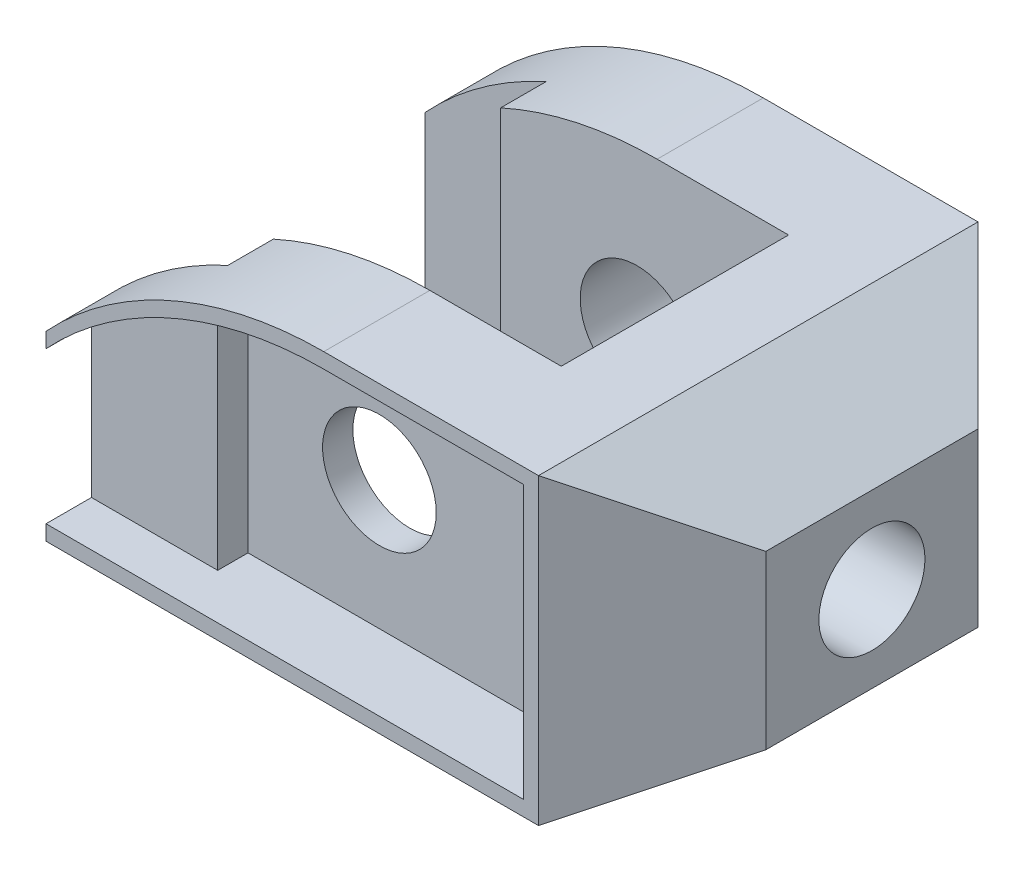
ISO-10303-21;
HEADER;
FILE_DESCRIPTION(('STEP AP214'),'2;1');
FILE_NAME('part.step','',(''),(''),'','','');
FILE_SCHEMA(('AUTOMOTIVE_DESIGN { 1 0 10303 214 1 1 1 1 }'));
ENDSEC;
DATA;
#1=APPLICATION_CONTEXT('core data for automotive mechanical design processes');
#2=APPLICATION_PROTOCOL_DEFINITION('international standard','automotive_design',2000,#1);
#3=PRODUCT_CONTEXT('',#1,'mechanical');
#4=PRODUCT('Part','Part','',(#3));
#5=PRODUCT_RELATED_PRODUCT_CATEGORY('part','',(#4));
#6=PRODUCT_DEFINITION_FORMATION('','',#4);
#7=PRODUCT_DEFINITION_CONTEXT('part definition',#1,'design');
#8=PRODUCT_DEFINITION('design','',#6,#7);
#9=PRODUCT_DEFINITION_SHAPE('','',#8);
#10=(LENGTH_UNIT() NAMED_UNIT(*) SI_UNIT(.MILLI.,.METRE.));
#11=(NAMED_UNIT(*) PLANE_ANGLE_UNIT() SI_UNIT($,.RADIAN.));
#12=(NAMED_UNIT(*) SI_UNIT($,.STERADIAN.) SOLID_ANGLE_UNIT());
#13=UNCERTAINTY_MEASURE_WITH_UNIT(LENGTH_MEASURE(1.E-05),#10,'distance_accuracy_value','');
#14=(GEOMETRIC_REPRESENTATION_CONTEXT(3) GLOBAL_UNCERTAINTY_ASSIGNED_CONTEXT((#13)) GLOBAL_UNIT_ASSIGNED_CONTEXT((#10,
#11,#12)) REPRESENTATION_CONTEXT('',''));
#15=CARTESIAN_POINT('',(0.,0.,0.));
#16=DIRECTION('',(0.,0.,1.));
#17=DIRECTION('',(1.,0.,0.));
#18=AXIS2_PLACEMENT_3D('',#15,#16,#17);
#19=CARTESIAN_POINT('',(-6.00000000000001,19.,-29.));
#20=DIRECTION('',(0.,0.,1.));
#21=DIRECTION('',(1.,0.,0.));
#22=AXIS2_PLACEMENT_3D('',#19,#20,#21);
#23=CYLINDRICAL_SURFACE('',#22,7.5);
#24=CARTESIAN_POINT('',(-6.00000000000001,19.,15.));
#25=DIRECTION('',(0.,0.,-1.));
#26=DIRECTION('',(-1.,0.,0.));
#27=AXIS2_PLACEMENT_3D('',#24,#25,#26);
#28=CIRCLE('',#27,7.5);
#29=CARTESIAN_POINT('',(-13.5,19.,15.));
#30=VERTEX_POINT('',#29);
#31=EDGE_CURVE('E378',#30,#30,#28,.F.);
#32=ORIENTED_EDGE('',*,*,#31,.F.);
#33=EDGE_LOOP('',(#32));
#34=FACE_BOUND('',#33,.T.);
#35=CARTESIAN_POINT('',(-6.00000000000001,19.,19.));
#36=DIRECTION('',(0.,0.,1.));
#37=DIRECTION('',(1.,0.,0.));
#38=AXIS2_PLACEMENT_3D('',#35,#36,#37);
#39=CIRCLE('',#38,7.5);
#40=CARTESIAN_POINT('',(1.49999999999999,19.,19.));
#41=VERTEX_POINT('',#40);
#42=EDGE_CURVE('E59',#41,#41,#39,.F.);
#43=ORIENTED_EDGE('',*,*,#42,.F.);
#44=EDGE_LOOP('',(#43));
#45=FACE_BOUND('',#44,.T.);
#46=ADVANCED_FACE('F55',(#34,#45),#23,.F.);
#47=CARTESIAN_POINT('',(-40.,40.,29.));
#48=DIRECTION('',(1.,0.,0.));
#49=DIRECTION('',(0.,0.,-1.));
#50=AXIS2_PLACEMENT_3D('',#47,#48,#49);
#51=PLANE('',#50);
#52=DIRECTION('',(0.,-1.,0.));
#53=VECTOR('',#52,1.);
#54=CARTESIAN_POINT('',(-40.,40.,-21.));
#55=LINE('',#54,#53);
#56=CARTESIAN_POINT('',(-40.,24.,-21.));
#57=VERTEX_POINT('',#56);
#58=CARTESIAN_POINT('',(-40.,0.,-21.));
#59=VERTEX_POINT('',#58);
#60=EDGE_CURVE('E309',#57,#59,#55,.T.);
#61=ORIENTED_EDGE('',*,*,#60,.F.);
#62=DIRECTION('',(0.,0.,1.));
#63=VECTOR('',#62,1.);
#64=CARTESIAN_POINT('',(-40.,24.,-29.));
#65=LINE('',#64,#63);
#66=CARTESIAN_POINT('',(-40.,24.,-29.));
#67=VERTEX_POINT('',#66);
#68=EDGE_CURVE('E417',#67,#57,#65,.T.);
#69=ORIENTED_EDGE('',*,*,#68,.F.);
#70=DIRECTION('',(0.,-1.,0.));
#71=VECTOR('',#70,1.);
#72=CARTESIAN_POINT('',(-40.,40.,-29.));
#73=LINE('',#72,#71);
#74=CARTESIAN_POINT('',(-40.,0.,-29.));
#75=VERTEX_POINT('',#74);
#76=EDGE_CURVE('E436',#67,#75,#73,.T.);
#77=ORIENTED_EDGE('',*,*,#76,.T.);
#78=DIRECTION('',(0.,0.,1.));
#79=VECTOR('',#78,1.);
#80=CARTESIAN_POINT('',(-40.,0.,29.));
#81=LINE('',#80,#79);
#82=EDGE_CURVE('E437',#75,#59,#81,.T.);
#83=ORIENTED_EDGE('',*,*,#82,.T.);
#84=EDGE_LOOP('',(#61,#69,#77,#83));
#85=FACE_BOUND('',#84,.T.);
#86=ADVANCED_FACE('F57',(#85),#51,.F.);
#87=DIRECTION('',(0.,-1.,0.));
#88=VECTOR('',#87,1.);
#89=CARTESIAN_POINT('',(-40.,22.,23.));
#90=LINE('',#89,#88);
#91=CARTESIAN_POINT('',(-40.,22.,23.));
#92=VERTEX_POINT('',#91);
#93=CARTESIAN_POINT('',(-40.,2.,23.));
#94=VERTEX_POINT('',#93);
#95=EDGE_CURVE('E253',#92,#94,#90,.T.);
#96=ORIENTED_EDGE('',*,*,#95,.F.);
#97=DIRECTION('',(0.,0.,1.));
#98=VECTOR('',#97,1.);
#99=CARTESIAN_POINT('',(-40.,22.,23.));
#100=LINE('',#99,#98);
#101=CARTESIAN_POINT('',(-40.,22.,29.));
#102=VERTEX_POINT('',#101);
#103=EDGE_CURVE('E277',#92,#102,#100,.T.);
#104=ORIENTED_EDGE('',*,*,#103,.T.);
#105=DIRECTION('',(0.,-1.,0.));
#106=VECTOR('',#105,1.);
#107=CARTESIAN_POINT('',(-40.,40.,29.));
#108=LINE('',#107,#106);
#109=CARTESIAN_POINT('',(-40.,24.,29.));
#110=VERTEX_POINT('',#109);
#111=EDGE_CURVE('E451',#110,#102,#108,.T.);
#112=ORIENTED_EDGE('',*,*,#111,.F.);
#113=CARTESIAN_POINT('',(-40.,24.,21.));
#114=VERTEX_POINT('',#113);
#115=EDGE_CURVE('E422',#114,#110,#65,.T.);
#116=ORIENTED_EDGE('',*,*,#115,.F.);
#117=DIRECTION('',(0.,-1.,0.));
#118=VECTOR('',#117,1.);
#119=CARTESIAN_POINT('',(-40.,40.,21.));
#120=LINE('',#119,#118);
#121=CARTESIAN_POINT('',(-40.,0.,21.));
#122=VERTEX_POINT('',#121);
#123=EDGE_CURVE('E312',#114,#122,#120,.T.);
#124=ORIENTED_EDGE('',*,*,#123,.T.);
#125=CARTESIAN_POINT('',(-40.,0.,29.));
#126=VERTEX_POINT('',#125);
#127=EDGE_CURVE('E421',#122,#126,#81,.T.);
#128=ORIENTED_EDGE('',*,*,#127,.T.);
#129=CARTESIAN_POINT('',(-40.,2.,29.));
#130=VERTEX_POINT('',#129);
#131=EDGE_CURVE('E450',#130,#126,#108,.T.);
#132=ORIENTED_EDGE('',*,*,#131,.F.);
#133=DIRECTION('',(0.,0.,1.));
#134=VECTOR('',#133,1.);
#135=CARTESIAN_POINT('',(-40.,2.,23.));
#136=LINE('',#135,#134);
#137=EDGE_CURVE('E81',#94,#130,#136,.T.);
#138=ORIENTED_EDGE('',*,*,#137,.F.);
#139=EDGE_LOOP('',(#96,#104,#112,#116,#124,#128,#132,#138));
#140=FACE_BOUND('',#139,.T.);
#141=ADVANCED_FACE('F528',(#140),#51,.F.);
#142=CARTESIAN_POINT('',(40.,40.,29.));
#143=DIRECTION('',(0.,0.,-1.));
#144=DIRECTION('',(-1.,0.,0.));
#145=AXIS2_PLACEMENT_3D('',#142,#143,#144);
#146=PLANE('',#145);
#147=ORIENTED_EDGE('',*,*,#111,.T.);
#148=CARTESIAN_POINT('',(-3.33939444035329,-12.,29.));
#149=DIRECTION('',(0.,0.,1.));
#150=DIRECTION('',(1.,0.,0.));
#151=AXIS2_PLACEMENT_3D('',#148,#149,#150);
#152=CIRCLE('',#151,50.);
#153=CARTESIAN_POINT('',(-3.3393944403533,38.,29.));
#154=VERTEX_POINT('',#153);
#155=EDGE_CURVE('E258',#154,#102,#152,.T.);
#156=ORIENTED_EDGE('',*,*,#155,.F.);
#157=DIRECTION('',(-1.,0.,0.));
#158=VECTOR('',#157,1.);
#159=CARTESIAN_POINT('',(23.,38.,29.));
#160=LINE('',#159,#158);
#161=CARTESIAN_POINT('',(23.,38.,29.));
#162=VERTEX_POINT('',#161);
#163=EDGE_CURVE('E271',#162,#154,#160,.T.);
#164=ORIENTED_EDGE('',*,*,#163,.F.);
#165=DIRECTION('',(0.,1.,0.));
#166=VECTOR('',#165,1.);
#167=CARTESIAN_POINT('',(23.,2.,29.));
#168=LINE('',#167,#166);
#169=CARTESIAN_POINT('',(23.,2.,29.));
#170=VERTEX_POINT('',#169);
#171=EDGE_CURVE('E267',#170,#162,#168,.T.);
#172=ORIENTED_EDGE('',*,*,#171,.F.);
#173=DIRECTION('',(1.,0.,0.));
#174=VECTOR('',#173,1.);
#175=CARTESIAN_POINT('',(-40.,2.,29.));
#176=LINE('',#175,#174);
#177=EDGE_CURVE('E264',#130,#170,#176,.T.);
#178=ORIENTED_EDGE('',*,*,#177,.F.);
#179=ORIENTED_EDGE('',*,*,#131,.T.);
#180=DIRECTION('',(1.,0.,0.));
#181=VECTOR('',#180,1.);
#182=CARTESIAN_POINT('',(40.,0.,29.));
#183=LINE('',#182,#181);
#184=CARTESIAN_POINT('',(25.,0.,29.));
#185=VERTEX_POINT('',#184);
#186=EDGE_CURVE('E441',#126,#185,#183,.T.);
#187=ORIENTED_EDGE('',*,*,#186,.T.);
#188=DIRECTION('',(0.,-1.,0.));
#189=VECTOR('',#188,1.);
#190=CARTESIAN_POINT('',(25.,40.,29.));
#191=LINE('',#190,#189);
#192=CARTESIAN_POINT('',(25.,40.,29.));
#193=VERTEX_POINT('',#192);
#194=EDGE_CURVE('E301',#193,#185,#191,.T.);
#195=ORIENTED_EDGE('',*,*,#194,.F.);
#196=DIRECTION('',(1.,0.,0.));
#197=VECTOR('',#196,1.);
#198=CARTESIAN_POINT('',(40.,40.,29.));
#199=LINE('',#198,#197);
#200=CARTESIAN_POINT('',(-3.33939444035328,40.,29.));
#201=VERTEX_POINT('',#200);
#202=EDGE_CURVE('E427',#201,#193,#199,.T.);
#203=ORIENTED_EDGE('',*,*,#202,.F.);
#204=CARTESIAN_POINT('',(-3.33939444035329,-10.,29.));
#205=DIRECTION('',(0.,0.,1.));
#206=DIRECTION('',(1.,0.,0.));
#207=AXIS2_PLACEMENT_3D('',#204,#205,#206);
#208=CIRCLE('',#207,50.);
#209=EDGE_CURVE('E394',#201,#110,#208,.T.);
#210=ORIENTED_EDGE('',*,*,#209,.T.);
#211=EDGE_LOOP('',(#147,#156,#164,#172,#178,#179,#187,#195,#203,#210));
#212=FACE_BOUND('',#211,.T.);
#213=ADVANCED_FACE('F521',(#212),#146,.F.);
#214=CARTESIAN_POINT('',(40.,40.,29.));
#215=DIRECTION('',(-1.,0.,0.));
#216=DIRECTION('',(0.,0.,1.));
#217=AXIS2_PLACEMENT_3D('',#214,#215,#216);
#218=PLANE('',#217);
#219=CARTESIAN_POINT('',(40.,20.,0.));
#220=DIRECTION('',(1.,0.,0.));
#221=DIRECTION('',(0.,0.,-1.));
#222=AXIS2_PLACEMENT_3D('',#219,#220,#221);
#223=CIRCLE('',#222,7.);
#224=CARTESIAN_POINT('',(40.,20.,-7.));
#225=VERTEX_POINT('',#224);
#226=EDGE_CURVE('E281',#225,#225,#223,.T.);
#227=ORIENTED_EDGE('',*,*,#226,.F.);
#228=EDGE_LOOP('',(#227));
#229=FACE_BOUND('',#228,.T.);
#230=DIRECTION('',(0.,-1.,0.));
#231=VECTOR('',#230,1.);
#232=CARTESIAN_POINT('',(40.,40.,14.0000000000001));
#233=LINE('',#232,#231);
#234=CARTESIAN_POINT('',(40.,31.3397459621557,14.0000000000002));
#235=VERTEX_POINT('',#234);
#236=CARTESIAN_POINT('',(40.,8.66025403784426,14.0000000000001));
#237=VERTEX_POINT('',#236);
#238=EDGE_CURVE('E297',#235,#237,#233,.T.);
#239=ORIENTED_EDGE('',*,*,#238,.T.);
#240=DIRECTION('',(0.,0.,1.));
#241=VECTOR('',#240,1.);
#242=CARTESIAN_POINT('',(40.,8.66025403784426,-29.));
#243=LINE('',#242,#241);
#244=CARTESIAN_POINT('',(40.,8.66025403784425,-14.0000000000002));
#245=VERTEX_POINT('',#244);
#246=EDGE_CURVE('E403',#245,#237,#243,.T.);
#247=ORIENTED_EDGE('',*,*,#246,.F.);
#248=DIRECTION('',(0.,-1.,0.));
#249=VECTOR('',#248,1.);
#250=CARTESIAN_POINT('',(40.,40.,-14.0000000000002));
#251=LINE('',#250,#249);
#252=CARTESIAN_POINT('',(40.,31.3397459621557,-14.0000000000002));
#253=VERTEX_POINT('',#252);
#254=EDGE_CURVE('E370',#253,#245,#251,.T.);
#255=ORIENTED_EDGE('',*,*,#254,.F.);
#256=DIRECTION('',(0.,0.,1.));
#257=VECTOR('',#256,1.);
#258=CARTESIAN_POINT('',(40.,31.3397459621557,-29.));
#259=LINE('',#258,#257);
#260=EDGE_CURVE('E395',#253,#235,#259,.T.);
#261=ORIENTED_EDGE('',*,*,#260,.T.);
#262=EDGE_LOOP('',(#239,#247,#255,#261));
#263=FACE_BOUND('',#262,.T.);
#264=ADVANCED_FACE('F541',(#229,#263),#218,.F.);
#265=CARTESIAN_POINT('',(40.,40.,-29.));
#266=DIRECTION('',(0.,0.,1.));
#267=DIRECTION('',(1.,0.,0.));
#268=AXIS2_PLACEMENT_3D('',#265,#266,#267);
#269=PLANE('',#268);
#270=CARTESIAN_POINT('',(-6.00000000000001,19.,-29.));
#271=DIRECTION('',(0.,0.,1.));
#272=DIRECTION('',(1.,0.,0.));
#273=AXIS2_PLACEMENT_3D('',#270,#271,#272);
#274=CIRCLE('',#273,7.5);
#275=CARTESIAN_POINT('',(1.49999999999999,19.,-29.));
#276=VERTEX_POINT('',#275);
#277=EDGE_CURVE('E389',#276,#276,#274,.T.);
#278=ORIENTED_EDGE('',*,*,#277,.T.);
#279=EDGE_LOOP('',(#278));
#280=FACE_BOUND('',#279,.T.);
#281=DIRECTION('',(0.,-1.,0.));
#282=VECTOR('',#281,1.);
#283=CARTESIAN_POINT('',(25.,40.,-29.));
#284=LINE('',#283,#282);
#285=CARTESIAN_POINT('',(25.,40.,-29.));
#286=VERTEX_POINT('',#285);
#287=CARTESIAN_POINT('',(25.,0.,-29.));
#288=VERTEX_POINT('',#287);
#289=EDGE_CURVE('E305',#286,#288,#284,.T.);
#290=ORIENTED_EDGE('',*,*,#289,.T.);
#291=DIRECTION('',(-1.,0.,0.));
#292=VECTOR('',#291,1.);
#293=CARTESIAN_POINT('',(40.,0.,-29.));
#294=LINE('',#293,#292);
#295=EDGE_CURVE('E432',#288,#75,#294,.T.);
#296=ORIENTED_EDGE('',*,*,#295,.T.);
#297=ORIENTED_EDGE('',*,*,#76,.F.);
#298=CARTESIAN_POINT('',(-3.33939444035329,-10.,-29.));
#299=DIRECTION('',(0.,0.,1.));
#300=DIRECTION('',(1.,0.,0.));
#301=AXIS2_PLACEMENT_3D('',#298,#299,#300);
#302=CIRCLE('',#301,50.);
#303=CARTESIAN_POINT('',(-3.33939444035329,40.,-29.));
#304=VERTEX_POINT('',#303);
#305=EDGE_CURVE('E410',#304,#67,#302,.T.);
#306=ORIENTED_EDGE('',*,*,#305,.F.);
#307=DIRECTION('',(-1.,0.,0.));
#308=VECTOR('',#307,1.);
#309=CARTESIAN_POINT('',(40.,40.,-29.));
#310=LINE('',#309,#308);
#311=EDGE_CURVE('E431',#286,#304,#310,.T.);
#312=ORIENTED_EDGE('',*,*,#311,.F.);
#313=EDGE_LOOP('',(#290,#296,#297,#306,#312));
#314=FACE_BOUND('',#313,.T.);
#315=ADVANCED_FACE('F551',(#280,#314),#269,.F.);
#316=CARTESIAN_POINT('',(0.,40.,0.));
#317=DIRECTION('',(0.,1.,0.));
#318=DIRECTION('',(0.,0.,1.));
#319=AXIS2_PLACEMENT_3D('',#316,#317,#318);
#320=PLANE('',#319);
#321=DIRECTION('',(0.,0.,-1.));
#322=VECTOR('',#321,1.);
#323=CARTESIAN_POINT('',(14.,40.,-15.));
#324=LINE('',#323,#322);
#325=CARTESIAN_POINT('',(14.,40.,15.));
#326=VERTEX_POINT('',#325);
#327=CARTESIAN_POINT('',(14.,40.,-15.));
#328=VERTEX_POINT('',#327);
#329=EDGE_CURVE('E362',#326,#328,#324,.T.);
#330=ORIENTED_EDGE('',*,*,#329,.F.);
#331=DIRECTION('',(1.,0.,0.));
#332=VECTOR('',#331,1.);
#333=CARTESIAN_POINT('',(-24.,40.,15.));
#334=LINE('',#333,#332);
#335=CARTESIAN_POINT('',(-3.33939444035329,40.,15.));
#336=VERTEX_POINT('',#335);
#337=EDGE_CURVE('E337',#336,#326,#334,.T.);
#338=ORIENTED_EDGE('',*,*,#337,.F.);
#339=DIRECTION('',(0.,0.,1.));
#340=VECTOR('',#339,1.);
#341=CARTESIAN_POINT('',(-3.33939444035329,40.,-29.));
#342=LINE('',#341,#340);
#343=EDGE_CURVE('E413',#336,#201,#342,.T.);
#344=ORIENTED_EDGE('',*,*,#343,.T.);
#345=ORIENTED_EDGE('',*,*,#202,.T.);
#346=DIRECTION('',(0.,0.,1.));
#347=VECTOR('',#346,1.);
#348=CARTESIAN_POINT('',(25.,40.,-29.));
#349=LINE('',#348,#347);
#350=EDGE_CURVE('E390',#286,#193,#349,.T.);
#351=ORIENTED_EDGE('',*,*,#350,.F.);
#352=ORIENTED_EDGE('',*,*,#311,.T.);
#353=CARTESIAN_POINT('',(-3.33939444035329,40.,-15.));
#354=VERTEX_POINT('',#353);
#355=EDGE_CURVE('E423',#304,#354,#342,.T.);
#356=ORIENTED_EDGE('',*,*,#355,.T.);
#357=DIRECTION('',(-1.,0.,0.));
#358=VECTOR('',#357,1.);
#359=CARTESIAN_POINT('',(-24.,40.,-15.));
#360=LINE('',#359,#358);
#361=EDGE_CURVE('E331',#328,#354,#360,.T.);
#362=ORIENTED_EDGE('',*,*,#361,.F.);
#363=EDGE_LOOP('',(#330,#338,#344,#345,#351,#352,#356,#362));
#364=FACE_BOUND('',#363,.T.);
#365=ADVANCED_FACE('F508',(#364),#320,.T.);
#366=CARTESIAN_POINT('',(0.,0.,0.));
#367=DIRECTION('',(0.,1.,0.));
#368=DIRECTION('',(0.,0.,1.));
#369=AXIS2_PLACEMENT_3D('',#366,#367,#368);
#370=PLANE('',#369);
#371=DIRECTION('',(-1.,0.,0.));
#372=VECTOR('',#371,1.);
#373=CARTESIAN_POINT('',(-40.,0.,-21.));
#374=LINE('',#373,#372);
#375=CARTESIAN_POINT('',(-24.,0.,-21.));
#376=VERTEX_POINT('',#375);
#377=EDGE_CURVE('E353',#376,#59,#374,.T.);
#378=ORIENTED_EDGE('',*,*,#377,.T.);
#379=ORIENTED_EDGE('',*,*,#82,.F.);
#380=ORIENTED_EDGE('',*,*,#295,.F.);
#381=DIRECTION('',(0.,0.,1.));
#382=VECTOR('',#381,1.);
#383=CARTESIAN_POINT('',(25.,0.,-29.));
#384=LINE('',#383,#382);
#385=EDGE_CURVE('E399',#288,#185,#384,.T.);
#386=ORIENTED_EDGE('',*,*,#385,.T.);
#387=ORIENTED_EDGE('',*,*,#186,.F.);
#388=ORIENTED_EDGE('',*,*,#127,.F.);
#389=DIRECTION('',(1.,0.,0.));
#390=VECTOR('',#389,1.);
#391=CARTESIAN_POINT('',(-40.,0.,21.));
#392=LINE('',#391,#390);
#393=CARTESIAN_POINT('',(-24.,0.,21.));
#394=VERTEX_POINT('',#393);
#395=EDGE_CURVE('E349',#122,#394,#392,.T.);
#396=ORIENTED_EDGE('',*,*,#395,.T.);
#397=DIRECTION('',(0.,0.,-1.));
#398=VECTOR('',#397,1.);
#399=CARTESIAN_POINT('',(-24.,0.,21.));
#400=LINE('',#399,#398);
#401=CARTESIAN_POINT('',(-24.,0.,15.));
#402=VERTEX_POINT('',#401);
#403=EDGE_CURVE('E345',#394,#402,#400,.T.);
#404=ORIENTED_EDGE('',*,*,#403,.T.);
#405=DIRECTION('',(1.,0.,0.));
#406=VECTOR('',#405,1.);
#407=CARTESIAN_POINT('',(-24.,0.,15.));
#408=LINE('',#407,#406);
#409=CARTESIAN_POINT('',(14.,0.,15.));
#410=VERTEX_POINT('',#409);
#411=EDGE_CURVE('E341',#402,#410,#408,.T.);
#412=ORIENTED_EDGE('',*,*,#411,.T.);
#413=DIRECTION('',(0.,0.,-1.));
#414=VECTOR('',#413,1.);
#415=CARTESIAN_POINT('',(14.,0.,-15.));
#416=LINE('',#415,#414);
#417=CARTESIAN_POINT('',(14.,0.,-15.));
#418=VERTEX_POINT('',#417);
#419=EDGE_CURVE('E336',#410,#418,#416,.T.);
#420=ORIENTED_EDGE('',*,*,#419,.T.);
#421=DIRECTION('',(-1.,0.,0.));
#422=VECTOR('',#421,1.);
#423=CARTESIAN_POINT('',(-24.,0.,-15.));
#424=LINE('',#423,#422);
#425=CARTESIAN_POINT('',(-24.,0.,-15.));
#426=VERTEX_POINT('',#425);
#427=EDGE_CURVE('E332',#418,#426,#424,.T.);
#428=ORIENTED_EDGE('',*,*,#427,.T.);
#429=DIRECTION('',(0.,0.,-1.));
#430=VECTOR('',#429,1.);
#431=CARTESIAN_POINT('',(-24.,0.,-21.));
#432=LINE('',#431,#430);
#433=EDGE_CURVE('E302',#426,#376,#432,.T.);
#434=ORIENTED_EDGE('',*,*,#433,.T.);
#435=EDGE_LOOP('',(#378,#379,#380,#386,#387,#388,#396,#404,#412,#420,#428,#434));
#436=FACE_BOUND('',#435,.T.);
#437=ADVANCED_FACE('F499',(#436),#370,.F.);
#438=CARTESIAN_POINT('',(6.24999999999986,-10.8253175473054,-29.));
#439=DIRECTION('',(-0.499999999999995,0.866025403784442,0.));
#440=DIRECTION('',(-0.866025403784442,-0.499999999999994,0.));
#441=AXIS2_PLACEMENT_3D('',#438,#439,#440);
#442=PLANE('',#441);
#443=DIRECTION('',(0.654653670707981,0.377964473009224,-0.654653670707975));
#444=VECTOR('',#443,1.);
#445=CARTESIAN_POINT('',(39.1428571428571,8.16538237853884,14.8571428571431));
#446=LINE('',#445,#444);
#447=EDGE_CURVE('E386',#185,#237,#446,.T.);
#448=ORIENTED_EDGE('',*,*,#447,.F.);
#449=ORIENTED_EDGE('',*,*,#385,.F.);
#450=DIRECTION('',(-0.654653670707982,-0.377964473009224,-0.654653670707974));
#451=VECTOR('',#450,1.);
#452=CARTESIAN_POINT('',(14.2857142857141,-6.18589574131741,-39.7142857142857));
#453=LINE('',#452,#451);
#454=EDGE_CURVE('E383',#245,#288,#453,.T.);
#455=ORIENTED_EDGE('',*,*,#454,.F.);
#456=ORIENTED_EDGE('',*,*,#246,.T.);
#457=EDGE_LOOP('',(#448,#449,#455,#456));
#458=FACE_BOUND('',#457,.T.);
#459=ADVANCED_FACE('F536',(#458),#442,.F.);
#460=CARTESIAN_POINT('',(-3.33939444035329,-10.,-29.));
#461=DIRECTION('',(0.,0.,1.));
#462=DIRECTION('',(1.,0.,0.));
#463=AXIS2_PLACEMENT_3D('',#460,#461,#462);
#464=CYLINDRICAL_SURFACE('',#463,50.);
#465=DIRECTION('',(0.,0.,1.));
#466=VECTOR('',#465,1.);
#467=CARTESIAN_POINT('',(-24.,35.5317403347236,-29.));
#468=LINE('',#467,#466);
#469=CARTESIAN_POINT('',(-24.,35.5317403347236,15.));
#470=VERTEX_POINT('',#469);
#471=CARTESIAN_POINT('',(-24.,35.5317403347236,21.));
#472=VERTEX_POINT('',#471);
#473=EDGE_CURVE('E65',#470,#472,#468,.T.);
#474=ORIENTED_EDGE('',*,*,#473,.T.);
#475=CARTESIAN_POINT('',(-3.33939444035329,-10.,21.));
#476=DIRECTION('',(0.,0.,-1.));
#477=DIRECTION('',(-1.,0.,0.));
#478=AXIS2_PLACEMENT_3D('',#475,#476,#477);
#479=CIRCLE('',#478,50.);
#480=EDGE_CURVE('E12',#472,#114,#479,.F.);
#481=ORIENTED_EDGE('',*,*,#480,.T.);
#482=ORIENTED_EDGE('',*,*,#115,.T.);
#483=ORIENTED_EDGE('',*,*,#209,.F.);
#484=ORIENTED_EDGE('',*,*,#343,.F.);
#485=CARTESIAN_POINT('',(-3.33939444035329,-10.,15.));
#486=DIRECTION('',(0.,0.,-1.));
#487=DIRECTION('',(-1.,0.,0.));
#488=AXIS2_PLACEMENT_3D('',#485,#486,#487);
#489=CIRCLE('',#488,50.);
#490=EDGE_CURVE('E379',#336,#470,#489,.F.);
#491=ORIENTED_EDGE('',*,*,#490,.T.);
#492=EDGE_LOOP('',(#474,#481,#482,#483,#484,#491));
#493=FACE_BOUND('',#492,.T.);
#494=ADVANCED_FACE('F512',(#493),#464,.T.);
#495=ORIENTED_EDGE('',*,*,#68,.T.);
#496=CARTESIAN_POINT('',(-3.33939444035329,-10.,-21.));
#497=DIRECTION('',(0.,0.,1.));
#498=DIRECTION('',(1.,0.,0.));
#499=AXIS2_PLACEMENT_3D('',#496,#497,#498);
#500=CIRCLE('',#499,50.);
#501=CARTESIAN_POINT('',(-24.,35.5317403347236,-21.));
#502=VERTEX_POINT('',#501);
#503=EDGE_CURVE('E473',#57,#502,#500,.F.);
#504=ORIENTED_EDGE('',*,*,#503,.T.);
#505=DIRECTION('',(0.,0.,1.));
#506=VECTOR('',#505,1.);
#507=CARTESIAN_POINT('',(-24.,35.5317403347236,-29.));
#508=LINE('',#507,#506);
#509=CARTESIAN_POINT('',(-24.,35.5317403347236,-15.));
#510=VERTEX_POINT('',#509);
#511=EDGE_CURVE('E469',#502,#510,#508,.T.);
#512=ORIENTED_EDGE('',*,*,#511,.T.);
#513=CARTESIAN_POINT('',(-3.33939444035329,-10.,-15.));
#514=DIRECTION('',(0.,0.,1.));
#515=DIRECTION('',(1.,0.,0.));
#516=AXIS2_PLACEMENT_3D('',#513,#514,#515);
#517=CIRCLE('',#516,50.);
#518=EDGE_CURVE('E374',#510,#354,#517,.F.);
#519=ORIENTED_EDGE('',*,*,#518,.T.);
#520=ORIENTED_EDGE('',*,*,#355,.F.);
#521=ORIENTED_EDGE('',*,*,#305,.T.);
#522=EDGE_LOOP('',(#495,#504,#512,#519,#520,#521));
#523=FACE_BOUND('',#522,.T.);
#524=ADVANCED_FACE('F555',(#523),#464,.T.);
#525=CARTESIAN_POINT('',(23.5705080756885,40.8253175473056,-29.));
#526=DIRECTION('',(0.499999999999995,0.866025403784442,0.));
#527=DIRECTION('',(-0.866025403784442,0.499999999999995,0.));
#528=AXIS2_PLACEMENT_3D('',#525,#526,#527);
#529=PLANE('',#528);
#530=ORIENTED_EDGE('',*,*,#350,.T.);
#531=DIRECTION('',(0.654653670707981,-0.377964473009224,-0.654653670707975));
#532=VECTOR('',#531,1.);
#533=CARTESIAN_POINT('',(49.0402903289649,26.1203319071755,4.95970967103531));
#534=LINE('',#533,#532);
#535=EDGE_CURVE('E465',#193,#235,#534,.T.);
#536=ORIENTED_EDGE('',*,*,#535,.T.);
#537=ORIENTED_EDGE('',*,*,#260,.F.);
#538=DIRECTION('',(-0.654653670707981,0.377964473009225,-0.654653670707974));
#539=VECTOR('',#538,1.);
#540=CARTESIAN_POINT('',(24.183147471822,40.4716100270318,-29.816852528178));
#541=LINE('',#540,#539);
#542=EDGE_CURVE('E455',#253,#286,#541,.T.);
#543=ORIENTED_EDGE('',*,*,#542,.T.);
#544=EDGE_LOOP('',(#530,#536,#537,#543));
#545=FACE_BOUND('',#544,.T.);
#546=ADVANCED_FACE('F545',(#545),#529,.T.);
#547=ORIENTED_EDGE('',*,*,#277,.F.);
#548=EDGE_LOOP('',(#547));
#549=FACE_BOUND('',#548,.T.);
#550=CARTESIAN_POINT('',(-6.00000000000001,19.,-15.));
#551=DIRECTION('',(0.,0.,1.));
#552=DIRECTION('',(1.,0.,0.));
#553=AXIS2_PLACEMENT_3D('',#550,#551,#552);
#554=CIRCLE('',#553,7.5);
#555=CARTESIAN_POINT('',(1.49999999999999,19.,-15.));
#556=VERTEX_POINT('',#555);
#557=EDGE_CURVE('E373',#556,#556,#554,.F.);
#558=ORIENTED_EDGE('',*,*,#557,.F.);
#559=EDGE_LOOP('',(#558));
#560=FACE_BOUND('',#559,.T.);
#561=ADVANCED_FACE('F573',(#549,#560),#23,.F.);
#562=CARTESIAN_POINT('',(-24.,40.,15.));
#563=DIRECTION('',(0.,0.,-1.));
#564=DIRECTION('',(-1.,0.,0.));
#565=AXIS2_PLACEMENT_3D('',#562,#563,#564);
#566=PLANE('',#565);
#567=ORIENTED_EDGE('',*,*,#337,.T.);
#568=DIRECTION('',(0.,-1.,0.));
#569=VECTOR('',#568,1.);
#570=CARTESIAN_POINT('',(14.,40.,15.));
#571=LINE('',#570,#569);
#572=EDGE_CURVE('E322',#326,#410,#571,.T.);
#573=ORIENTED_EDGE('',*,*,#572,.T.);
#574=ORIENTED_EDGE('',*,*,#411,.F.);
#575=DIRECTION('',(0.,-1.,0.));
#576=VECTOR('',#575,1.);
#577=CARTESIAN_POINT('',(-24.,40.,15.));
#578=LINE('',#577,#576);
#579=EDGE_CURVE('E319',#470,#402,#578,.T.);
#580=ORIENTED_EDGE('',*,*,#579,.F.);
#581=ORIENTED_EDGE('',*,*,#490,.F.);
#582=EDGE_LOOP('',(#567,#573,#574,#580,#581));
#583=FACE_BOUND('',#582,.T.);
#584=ORIENTED_EDGE('',*,*,#31,.T.);
#585=EDGE_LOOP('',(#584));
#586=FACE_BOUND('',#585,.T.);
#587=ADVANCED_FACE('F503',(#583,#586),#566,.T.);
#588=CARTESIAN_POINT('',(-24.,40.,-15.));
#589=DIRECTION('',(0.,0.,1.));
#590=DIRECTION('',(1.,0.,0.));
#591=AXIS2_PLACEMENT_3D('',#588,#589,#590);
#592=PLANE('',#591);
#593=DIRECTION('',(0.,-1.,0.));
#594=VECTOR('',#593,1.);
#595=CARTESIAN_POINT('',(-24.,40.,-15.));
#596=LINE('',#595,#594);
#597=EDGE_CURVE('E328',#510,#426,#596,.T.);
#598=ORIENTED_EDGE('',*,*,#597,.T.);
#599=ORIENTED_EDGE('',*,*,#427,.F.);
#600=DIRECTION('',(0.,-1.,0.));
#601=VECTOR('',#600,1.);
#602=CARTESIAN_POINT('',(14.,40.,-15.));
#603=LINE('',#602,#601);
#604=EDGE_CURVE('E325',#328,#418,#603,.T.);
#605=ORIENTED_EDGE('',*,*,#604,.F.);
#606=ORIENTED_EDGE('',*,*,#361,.T.);
#607=ORIENTED_EDGE('',*,*,#518,.F.);
#608=EDGE_LOOP('',(#598,#599,#605,#606,#607));
#609=FACE_BOUND('',#608,.T.);
#610=ORIENTED_EDGE('',*,*,#557,.T.);
#611=EDGE_LOOP('',(#610));
#612=FACE_BOUND('',#611,.T.);
#613=ADVANCED_FACE('F567',(#609,#612),#592,.T.);
#614=CARTESIAN_POINT('',(-24.,40.,-21.));
#615=DIRECTION('',(-1.,0.,0.));
#616=DIRECTION('',(0.,0.,1.));
#617=AXIS2_PLACEMENT_3D('',#614,#615,#616);
#618=PLANE('',#617);
#619=DIRECTION('',(0.,-1.,0.));
#620=VECTOR('',#619,1.);
#621=CARTESIAN_POINT('',(-24.,40.,-21.));
#622=LINE('',#621,#620);
#623=EDGE_CURVE('E306',#502,#376,#622,.T.);
#624=ORIENTED_EDGE('',*,*,#623,.T.);
#625=ORIENTED_EDGE('',*,*,#433,.F.);
#626=ORIENTED_EDGE('',*,*,#597,.F.);
#627=ORIENTED_EDGE('',*,*,#511,.F.);
#628=EDGE_LOOP('',(#624,#625,#626,#627));
#629=FACE_BOUND('',#628,.T.);
#630=ADVANCED_FACE('F565',(#629),#618,.T.);
#631=CARTESIAN_POINT('',(-40.,40.,-21.));
#632=DIRECTION('',(0.,0.,1.));
#633=DIRECTION('',(1.,0.,0.));
#634=AXIS2_PLACEMENT_3D('',#631,#632,#633);
#635=PLANE('',#634);
#636=ORIENTED_EDGE('',*,*,#60,.T.);
#637=ORIENTED_EDGE('',*,*,#377,.F.);
#638=ORIENTED_EDGE('',*,*,#623,.F.);
#639=ORIENTED_EDGE('',*,*,#503,.F.);
#640=EDGE_LOOP('',(#636,#637,#638,#639));
#641=FACE_BOUND('',#640,.T.);
#642=ADVANCED_FACE('F560',(#641),#635,.T.);
#643=CARTESIAN_POINT('',(-40.,40.,21.));
#644=DIRECTION('',(0.,0.,-1.));
#645=DIRECTION('',(-1.,0.,0.));
#646=AXIS2_PLACEMENT_3D('',#643,#644,#645);
#647=PLANE('',#646);
#648=DIRECTION('',(0.,-1.,0.));
#649=VECTOR('',#648,1.);
#650=CARTESIAN_POINT('',(-24.,40.,21.));
#651=LINE('',#650,#649);
#652=EDGE_CURVE('E316',#472,#394,#651,.T.);
#653=ORIENTED_EDGE('',*,*,#652,.T.);
#654=ORIENTED_EDGE('',*,*,#395,.F.);
#655=ORIENTED_EDGE('',*,*,#123,.F.);
#656=ORIENTED_EDGE('',*,*,#480,.F.);
#657=EDGE_LOOP('',(#653,#654,#655,#656));
#658=FACE_BOUND('',#657,.T.);
#659=ADVANCED_FACE('F631',(#658),#647,.T.);
#660=CARTESIAN_POINT('',(-24.,40.,21.));
#661=DIRECTION('',(-1.,0.,0.));
#662=DIRECTION('',(0.,0.,1.));
#663=AXIS2_PLACEMENT_3D('',#660,#661,#662);
#664=PLANE('',#663);
#665=ORIENTED_EDGE('',*,*,#579,.T.);
#666=ORIENTED_EDGE('',*,*,#403,.F.);
#667=ORIENTED_EDGE('',*,*,#652,.F.);
#668=ORIENTED_EDGE('',*,*,#473,.F.);
#669=EDGE_LOOP('',(#665,#666,#667,#668));
#670=FACE_BOUND('',#669,.T.);
#671=ADVANCED_FACE('F490',(#670),#664,.T.);
#672=CARTESIAN_POINT('',(14.,40.,-15.));
#673=DIRECTION('',(-1.,0.,0.));
#674=DIRECTION('',(0.,0.,1.));
#675=AXIS2_PLACEMENT_3D('',#672,#673,#674);
#676=PLANE('',#675);
#677=CARTESIAN_POINT('',(14.,20.,0.));
#678=DIRECTION('',(-1.,0.,0.));
#679=DIRECTION('',(0.,0.,1.));
#680=AXIS2_PLACEMENT_3D('',#677,#678,#679);
#681=CIRCLE('',#680,7.);
#682=CARTESIAN_POINT('',(14.,20.,6.99999999999999));
#683=VERTEX_POINT('',#682);
#684=EDGE_CURVE('E296',#683,#683,#681,.T.);
#685=ORIENTED_EDGE('',*,*,#684,.F.);
#686=EDGE_LOOP('',(#685));
#687=FACE_BOUND('',#686,.T.);
#688=ORIENTED_EDGE('',*,*,#419,.F.);
#689=ORIENTED_EDGE('',*,*,#572,.F.);
#690=ORIENTED_EDGE('',*,*,#329,.T.);
#691=ORIENTED_EDGE('',*,*,#604,.T.);
#692=EDGE_LOOP('',(#688,#689,#690,#691));
#693=FACE_BOUND('',#692,.T.);
#694=ADVANCED_FACE('F486',(#687,#693),#676,.T.);
#695=CARTESIAN_POINT('',(40.,40.,-14.0000000000002));
#696=DIRECTION('',(0.707106781186544,0.,-0.707106781186551));
#697=DIRECTION('',(-0.707106781186551,0.,-0.707106781186544));
#698=AXIS2_PLACEMENT_3D('',#695,#696,#697);
#699=PLANE('',#698);
#700=ORIENTED_EDGE('',*,*,#454,.T.);
#701=ORIENTED_EDGE('',*,*,#289,.F.);
#702=ORIENTED_EDGE('',*,*,#542,.F.);
#703=ORIENTED_EDGE('',*,*,#254,.T.);
#704=EDGE_LOOP('',(#700,#701,#702,#703));
#705=FACE_BOUND('',#704,.T.);
#706=ADVANCED_FACE('F489',(#705),#699,.T.);
#707=CARTESIAN_POINT('',(40.,40.,14.0000000000001));
#708=DIRECTION('',(0.707106781186544,0.,0.707106781186551));
#709=DIRECTION('',(0.707106781186551,0.,-0.707106781186544));
#710=AXIS2_PLACEMENT_3D('',#707,#708,#709);
#711=PLANE('',#710);
#712=ORIENTED_EDGE('',*,*,#447,.T.);
#713=ORIENTED_EDGE('',*,*,#238,.F.);
#714=ORIENTED_EDGE('',*,*,#535,.F.);
#715=ORIENTED_EDGE('',*,*,#194,.T.);
#716=EDGE_LOOP('',(#712,#713,#714,#715));
#717=FACE_BOUND('',#716,.T.);
#718=ADVANCED_FACE('F539',(#717),#711,.T.);
#719=CARTESIAN_POINT('',(-40.,20.,0.));
#720=DIRECTION('',(1.,0.,0.));
#721=DIRECTION('',(0.,0.,-1.));
#722=AXIS2_PLACEMENT_3D('',#719,#720,#721);
#723=CYLINDRICAL_SURFACE('',#722,7.);
#724=ORIENTED_EDGE('',*,*,#684,.T.);
#725=EDGE_LOOP('',(#724));
#726=FACE_BOUND('',#725,.T.);
#727=ORIENTED_EDGE('',*,*,#226,.T.);
#728=EDGE_LOOP('',(#727));
#729=FACE_BOUND('',#728,.T.);
#730=ADVANCED_FACE('F483',(#726,#729),#723,.F.);
#731=CARTESIAN_POINT('',(-3.33939444035329,-12.,23.));
#732=DIRECTION('',(0.,0.,1.));
#733=DIRECTION('',(1.,0.,0.));
#734=AXIS2_PLACEMENT_3D('',#731,#732,#733);
#735=PLANE('',#734);
#736=DIRECTION('',(0.,-1.,0.));
#737=VECTOR('',#736,1.);
#738=CARTESIAN_POINT('',(-23.3393944403533,33.8257569495584,23.));
#739=LINE('',#738,#737);
#740=CARTESIAN_POINT('',(-23.3393944403533,33.8257569495584,23.));
#741=VERTEX_POINT('',#740);
#742=CARTESIAN_POINT('',(-23.3393944403533,2.,23.));
#743=VERTEX_POINT('',#742);
#744=EDGE_CURVE('E73',#741,#743,#739,.T.);
#745=ORIENTED_EDGE('',*,*,#744,.F.);
#746=CARTESIAN_POINT('',(-3.33939444035329,-12.,23.));
#747=DIRECTION('',(0.,0.,1.));
#748=DIRECTION('',(1.,0.,0.));
#749=AXIS2_PLACEMENT_3D('',#746,#747,#748);
#750=CIRCLE('',#749,50.);
#751=EDGE_CURVE('E221',#741,#92,#750,.T.);
#752=ORIENTED_EDGE('',*,*,#751,.T.);
#753=ORIENTED_EDGE('',*,*,#95,.T.);
#754=DIRECTION('',(1.,0.,0.));
#755=VECTOR('',#754,1.);
#756=CARTESIAN_POINT('',(-40.,2.,23.));
#757=LINE('',#756,#755);
#758=EDGE_CURVE('E257',#94,#743,#757,.T.);
#759=ORIENTED_EDGE('',*,*,#758,.T.);
#760=EDGE_LOOP('',(#745,#752,#753,#759));
#761=FACE_BOUND('',#760,.T.);
#762=ADVANCED_FACE('F610',(#761),#735,.T.);
#763=CARTESIAN_POINT('',(-3.33939444035329,-12.,23.));
#764=DIRECTION('',(0.,0.,1.));
#765=DIRECTION('',(1.,0.,0.));
#766=AXIS2_PLACEMENT_3D('',#763,#764,#765);
#767=CYLINDRICAL_SURFACE('',#766,50.);
#768=ORIENTED_EDGE('',*,*,#155,.T.);
#769=ORIENTED_EDGE('',*,*,#103,.F.);
#770=ORIENTED_EDGE('',*,*,#751,.F.);
#771=DIRECTION('',(0.,0.,1.));
#772=VECTOR('',#771,1.);
#773=CARTESIAN_POINT('',(-23.3393944403533,33.8257569495584,19.));
#774=LINE('',#773,#772);
#775=CARTESIAN_POINT('',(-23.3393944403533,33.8257569495584,19.));
#776=VERTEX_POINT('',#775);
#777=EDGE_CURVE('E214',#776,#741,#774,.T.);
#778=ORIENTED_EDGE('',*,*,#777,.F.);
#779=CARTESIAN_POINT('',(-3.33939444035328,-12.,19.));
#780=DIRECTION('',(0.,0.,1.));
#781=DIRECTION('',(1.,0.,0.));
#782=AXIS2_PLACEMENT_3D('',#779,#780,#781);
#783=CIRCLE('',#782,50.);
#784=CARTESIAN_POINT('',(-3.3393944403533,38.,19.));
#785=VERTEX_POINT('',#784);
#786=EDGE_CURVE('E218',#785,#776,#783,.T.);
#787=ORIENTED_EDGE('',*,*,#786,.F.);
#788=DIRECTION('',(0.,0.,1.));
#789=VECTOR('',#788,1.);
#790=CARTESIAN_POINT('',(-3.3393944403533,38.,23.));
#791=LINE('',#790,#789);
#792=EDGE_CURVE('E282',#785,#154,#791,.T.);
#793=ORIENTED_EDGE('',*,*,#792,.T.);
#794=EDGE_LOOP('',(#768,#769,#770,#778,#787,#793));
#795=FACE_BOUND('',#794,.T.);
#796=ADVANCED_FACE('F216',(#795),#767,.F.);
#797=CARTESIAN_POINT('',(23.,38.,23.));
#798=DIRECTION('',(0.,1.,0.));
#799=DIRECTION('',(-1.,0.,0.));
#800=AXIS2_PLACEMENT_3D('',#797,#798,#799);
#801=PLANE('',#800);
#802=ORIENTED_EDGE('',*,*,#163,.T.);
#803=ORIENTED_EDGE('',*,*,#792,.F.);
#804=DIRECTION('',(-1.,0.,0.));
#805=VECTOR('',#804,1.);
#806=CARTESIAN_POINT('',(23.,38.,19.));
#807=LINE('',#806,#805);
#808=CARTESIAN_POINT('',(23.,38.,19.));
#809=VERTEX_POINT('',#808);
#810=EDGE_CURVE('E224',#809,#785,#807,.T.);
#811=ORIENTED_EDGE('',*,*,#810,.F.);
#812=DIRECTION('',(0.,0.,1.));
#813=VECTOR('',#812,1.);
#814=CARTESIAN_POINT('',(23.,38.,23.));
#815=LINE('',#814,#813);
#816=EDGE_CURVE('E285',#809,#162,#815,.T.);
#817=ORIENTED_EDGE('',*,*,#816,.T.);
#818=EDGE_LOOP('',(#802,#803,#811,#817));
#819=FACE_BOUND('',#818,.T.);
#820=ADVANCED_FACE('F616',(#819),#801,.F.);
#821=CARTESIAN_POINT('',(23.,2.,23.));
#822=DIRECTION('',(1.,0.,0.));
#823=DIRECTION('',(0.,0.,-1.));
#824=AXIS2_PLACEMENT_3D('',#821,#822,#823);
#825=PLANE('',#824);
#826=ORIENTED_EDGE('',*,*,#171,.T.);
#827=ORIENTED_EDGE('',*,*,#816,.F.);
#828=DIRECTION('',(0.,1.,0.));
#829=VECTOR('',#828,1.);
#830=CARTESIAN_POINT('',(23.,2.,19.));
#831=LINE('',#830,#829);
#832=CARTESIAN_POINT('',(23.,2.,19.));
#833=VERTEX_POINT('',#832);
#834=EDGE_CURVE('E246',#833,#809,#831,.T.);
#835=ORIENTED_EDGE('',*,*,#834,.F.);
#836=DIRECTION('',(0.,0.,1.));
#837=VECTOR('',#836,1.);
#838=CARTESIAN_POINT('',(23.,2.,23.));
#839=LINE('',#838,#837);
#840=EDGE_CURVE('E288',#833,#170,#839,.T.);
#841=ORIENTED_EDGE('',*,*,#840,.T.);
#842=EDGE_LOOP('',(#826,#827,#835,#841));
#843=FACE_BOUND('',#842,.T.);
#844=ADVANCED_FACE('F607',(#843),#825,.F.);
#845=CARTESIAN_POINT('',(-40.,2.,23.));
#846=DIRECTION('',(0.,-1.,0.));
#847=DIRECTION('',(1.,0.,0.));
#848=AXIS2_PLACEMENT_3D('',#845,#846,#847);
#849=PLANE('',#848);
#850=ORIENTED_EDGE('',*,*,#177,.T.);
#851=ORIENTED_EDGE('',*,*,#840,.F.);
#852=DIRECTION('',(1.,0.,0.));
#853=VECTOR('',#852,1.);
#854=CARTESIAN_POINT('',(-23.3393944403533,2.,19.));
#855=LINE('',#854,#853);
#856=CARTESIAN_POINT('',(-23.3393944403533,2.,19.));
#857=VERTEX_POINT('',#856);
#858=EDGE_CURVE('E233',#857,#833,#855,.T.);
#859=ORIENTED_EDGE('',*,*,#858,.F.);
#860=DIRECTION('',(0.,0.,1.));
#861=VECTOR('',#860,1.);
#862=CARTESIAN_POINT('',(-23.3393944403533,2.,19.));
#863=LINE('',#862,#861);
#864=EDGE_CURVE('E223',#857,#743,#863,.T.);
#865=ORIENTED_EDGE('',*,*,#864,.T.);
#866=ORIENTED_EDGE('',*,*,#758,.F.);
#867=ORIENTED_EDGE('',*,*,#137,.T.);
#868=EDGE_LOOP('',(#850,#851,#859,#865,#866,#867));
#869=FACE_BOUND('',#868,.T.);
#870=ADVANCED_FACE('F600',(#869),#849,.F.);
#871=CARTESIAN_POINT('',(-3.33939444035328,-12.,19.));
#872=DIRECTION('',(0.,0.,1.));
#873=DIRECTION('',(1.,0.,0.));
#874=AXIS2_PLACEMENT_3D('',#871,#872,#873);
#875=PLANE('',#874);
#876=ORIENTED_EDGE('',*,*,#786,.T.);
#877=DIRECTION('',(0.,-1.,0.));
#878=VECTOR('',#877,1.);
#879=CARTESIAN_POINT('',(-23.3393944403533,33.8257569495584,19.));
#880=LINE('',#879,#878);
#881=EDGE_CURVE('E227',#776,#857,#880,.T.);
#882=ORIENTED_EDGE('',*,*,#881,.T.);
#883=ORIENTED_EDGE('',*,*,#858,.T.);
#884=ORIENTED_EDGE('',*,*,#834,.T.);
#885=ORIENTED_EDGE('',*,*,#810,.T.);
#886=EDGE_LOOP('',(#876,#882,#883,#884,#885));
#887=FACE_BOUND('',#886,.T.);
#888=ORIENTED_EDGE('',*,*,#42,.T.);
#889=EDGE_LOOP('',(#888));
#890=FACE_BOUND('',#889,.T.);
#891=ADVANCED_FACE('F235',(#887,#890),#875,.T.);
#892=CARTESIAN_POINT('',(-23.3393944403533,33.8257569495584,19.));
#893=DIRECTION('',(-1.,0.,0.));
#894=DIRECTION('',(0.,-1.,0.));
#895=AXIS2_PLACEMENT_3D('',#892,#893,#894);
#896=PLANE('',#895);
#897=ORIENTED_EDGE('',*,*,#744,.T.);
#898=ORIENTED_EDGE('',*,*,#864,.F.);
#899=ORIENTED_EDGE('',*,*,#881,.F.);
#900=ORIENTED_EDGE('',*,*,#777,.T.);
#901=EDGE_LOOP('',(#897,#898,#899,#900));
#902=FACE_BOUND('',#901,.T.);
#903=ADVANCED_FACE('F228',(#902),#896,.F.);
#904=CLOSED_SHELL('',(#46,#86,#141,#213,#264,#315,#365,#437,#459,#494,#524,#546,#561,#587,#613,
#630,#642,#659,#671,#694,#706,#718,#730,#762,#796,#820,#844,#870,#891,#903));
#905=MANIFOLD_SOLID_BREP('B2',#904);
#906=ADVANCED_BREP_SHAPE_REPRESENTATION('',(#18,#905),#14);
#907=SHAPE_DEFINITION_REPRESENTATION(#9,#906);
ENDSEC;
END-ISO-10303-21;
